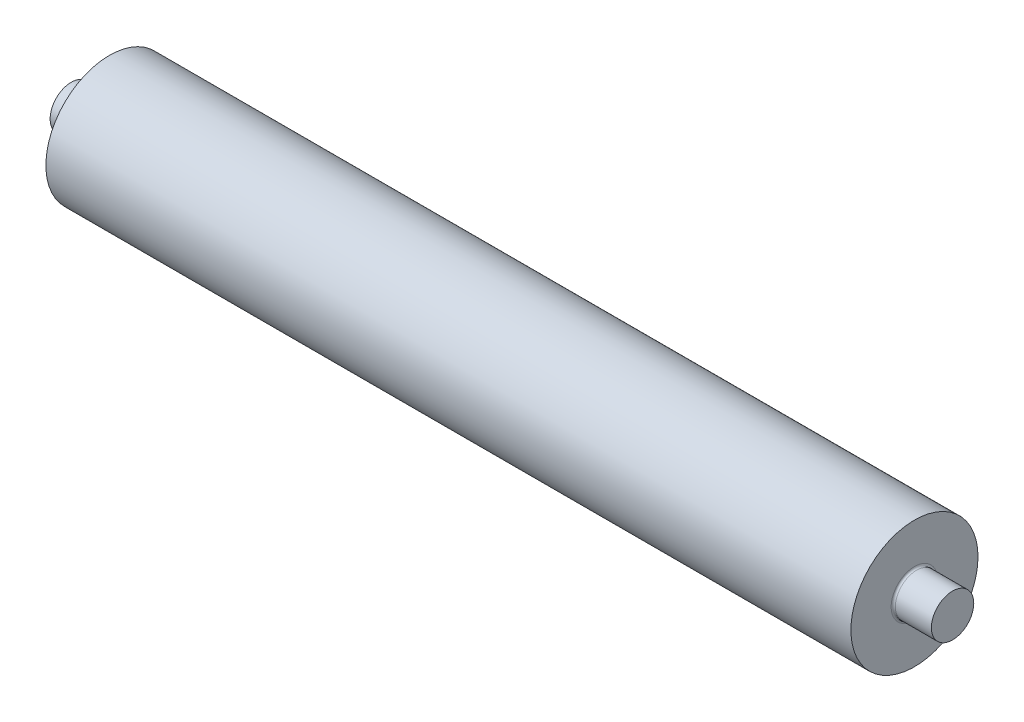
ISO-10303-21;
HEADER;
FILE_DESCRIPTION(('STEP AP214'),'2;1');
FILE_NAME('part.step','',(''),(''),'','','');
FILE_SCHEMA(('AUTOMOTIVE_DESIGN { 1 0 10303 214 1 1 1 1 }'));
ENDSEC;
DATA;
#1=APPLICATION_CONTEXT('core data for automotive mechanical design processes');
#2=APPLICATION_PROTOCOL_DEFINITION('international standard','automotive_design',2000,#1);
#3=PRODUCT_CONTEXT('',#1,'mechanical');
#4=PRODUCT('Part','Part','',(#3));
#5=PRODUCT_RELATED_PRODUCT_CATEGORY('part','',(#4));
#6=PRODUCT_DEFINITION_FORMATION('','',#4);
#7=PRODUCT_DEFINITION_CONTEXT('part definition',#1,'design');
#8=PRODUCT_DEFINITION('design','',#6,#7);
#9=PRODUCT_DEFINITION_SHAPE('','',#8);
#10=(LENGTH_UNIT() NAMED_UNIT(*) SI_UNIT(.MILLI.,.METRE.));
#11=(NAMED_UNIT(*) PLANE_ANGLE_UNIT() SI_UNIT($,.RADIAN.));
#12=(NAMED_UNIT(*) SI_UNIT($,.STERADIAN.) SOLID_ANGLE_UNIT());
#13=UNCERTAINTY_MEASURE_WITH_UNIT(LENGTH_MEASURE(1.E-05),#10,'distance_accuracy_value','');
#14=(GEOMETRIC_REPRESENTATION_CONTEXT(3) GLOBAL_UNCERTAINTY_ASSIGNED_CONTEXT((#13)) GLOBAL_UNIT_ASSIGNED_CONTEXT((#10,
#11,#12)) REPRESENTATION_CONTEXT('',''));
#15=CARTESIAN_POINT('',(0.,0.,0.));
#16=DIRECTION('',(0.,0.,1.));
#17=DIRECTION('',(1.,0.,0.));
#18=AXIS2_PLACEMENT_3D('',#15,#16,#17);
#19=CARTESIAN_POINT('',(1040.,0.,0.));
#20=DIRECTION('',(1.,0.,0.));
#21=DIRECTION('',(0.,0.,-1.));
#22=AXIS2_PLACEMENT_3D('',#19,#20,#21);
#23=PLANE('',#22);
#24=CARTESIAN_POINT('',(1040.,0.,0.));
#25=DIRECTION('',(1.,0.,0.));
#26=DIRECTION('',(0.,0.,-1.));
#27=AXIS2_PLACEMENT_3D('',#24,#25,#26);
#28=CIRCLE('',#27,49.9999999999999);
#29=CARTESIAN_POINT('',(1040.,0.,-49.9999999999999));
#30=VERTEX_POINT('',#29);
#31=EDGE_CURVE('E61',#30,#30,#28,.T.);
#32=ORIENTED_EDGE('',*,*,#31,.T.);
#33=EDGE_LOOP('',(#32));
#34=FACE_BOUND('',#33,.T.);
#35=ADVANCED_FACE('F41',(#34),#23,.T.);
#36=CARTESIAN_POINT('',(1040.,0.,0.));
#37=DIRECTION('',(1.,0.,0.));
#38=DIRECTION('',(0.,0.,-1.));
#39=AXIS2_PLACEMENT_3D('',#36,#37,#38);
#40=CYLINDRICAL_SURFACE('',#39,49.9999999999999);
#41=CARTESIAN_POINT('',(955.,0.,0.));
#42=DIRECTION('',(1.,0.,0.));
#43=DIRECTION('',(0.,0.,-1.));
#44=AXIS2_PLACEMENT_3D('',#41,#42,#43);
#45=CIRCLE('',#44,49.9999999999999);
#46=CARTESIAN_POINT('',(955.,0.,-49.9999999999999));
#47=VERTEX_POINT('',#46);
#48=EDGE_CURVE('E56',#47,#47,#45,.T.);
#49=ORIENTED_EDGE('',*,*,#48,.T.);
#50=EDGE_LOOP('',(#49));
#51=FACE_BOUND('',#50,.T.);
#52=ORIENTED_EDGE('',*,*,#31,.F.);
#53=EDGE_LOOP('',(#52));
#54=FACE_BOUND('',#53,.T.);
#55=ADVANCED_FACE('F90',(#51,#54),#40,.T.);
#56=CARTESIAN_POINT('',(950.,0.,-49.9999999999999));
#57=DIRECTION('',(1.,0.,0.));
#58=DIRECTION('',(0.,0.,-1.));
#59=AXIS2_PLACEMENT_3D('',#56,#57,#58);
#60=PLANE('',#59);
#61=CARTESIAN_POINT('',(950.,0.,0.));
#62=DIRECTION('',(1.,0.,0.));
#63=DIRECTION('',(0.,0.,-1.));
#64=AXIS2_PLACEMENT_3D('',#61,#62,#63);
#65=CIRCLE('',#64,54.9999999999999);
#66=CARTESIAN_POINT('',(950.,0.,-54.9999999999999));
#67=VERTEX_POINT('',#66);
#68=EDGE_CURVE('E52',#67,#67,#65,.F.);
#69=ORIENTED_EDGE('',*,*,#68,.T.);
#70=EDGE_LOOP('',(#69));
#71=FACE_BOUND('',#70,.T.);
#72=CARTESIAN_POINT('',(950.,0.,0.));
#73=DIRECTION('',(1.,0.,0.));
#74=DIRECTION('',(0.,0.,-1.));
#75=AXIS2_PLACEMENT_3D('',#72,#73,#74);
#76=CIRCLE('',#75,150.);
#77=CARTESIAN_POINT('',(950.,0.,-150.));
#78=VERTEX_POINT('',#77);
#79=EDGE_CURVE('E64',#78,#78,#76,.T.);
#80=ORIENTED_EDGE('',*,*,#79,.T.);
#81=EDGE_LOOP('',(#80));
#82=FACE_BOUND('',#81,.T.);
#83=ADVANCED_FACE('F95',(#71,#82),#60,.T.);
#84=CARTESIAN_POINT('',(1040.,0.,0.));
#85=DIRECTION('',(1.,0.,0.));
#86=DIRECTION('',(0.,0.,-1.));
#87=AXIS2_PLACEMENT_3D('',#84,#85,#86);
#88=CYLINDRICAL_SURFACE('',#87,150.);
#89=CARTESIAN_POINT('',(-950.,0.,0.));
#90=DIRECTION('',(1.,0.,0.));
#91=DIRECTION('',(0.,0.,-1.));
#92=AXIS2_PLACEMENT_3D('',#89,#90,#91);
#93=CIRCLE('',#92,150.);
#94=CARTESIAN_POINT('',(-950.,0.,-150.));
#95=VERTEX_POINT('',#94);
#96=EDGE_CURVE('E67',#95,#95,#93,.T.);
#97=ORIENTED_EDGE('',*,*,#96,.T.);
#98=EDGE_LOOP('',(#97));
#99=FACE_BOUND('',#98,.T.);
#100=ORIENTED_EDGE('',*,*,#79,.F.);
#101=EDGE_LOOP('',(#100));
#102=FACE_BOUND('',#101,.T.);
#103=ADVANCED_FACE('F101',(#99,#102),#88,.T.);
#104=CARTESIAN_POINT('',(-950.,0.,-49.9999999999999));
#105=DIRECTION('',(-1.,0.,0.));
#106=DIRECTION('',(0.,0.,1.));
#107=AXIS2_PLACEMENT_3D('',#104,#105,#106);
#108=PLANE('',#107);
#109=CARTESIAN_POINT('',(-950.,0.,0.));
#110=DIRECTION('',(-1.,0.,0.));
#111=DIRECTION('',(0.,0.,1.));
#112=AXIS2_PLACEMENT_3D('',#109,#110,#111);
#113=CIRCLE('',#112,54.9999999999999);
#114=CARTESIAN_POINT('',(-950.,0.,54.9999999999999));
#115=VERTEX_POINT('',#114);
#116=EDGE_CURVE('E48',#115,#115,#113,.F.);
#117=ORIENTED_EDGE('',*,*,#116,.T.);
#118=EDGE_LOOP('',(#117));
#119=FACE_BOUND('',#118,.T.);
#120=ORIENTED_EDGE('',*,*,#96,.F.);
#121=EDGE_LOOP('',(#120));
#122=FACE_BOUND('',#121,.T.);
#123=ADVANCED_FACE('F87',(#119,#122),#108,.T.);
#124=CARTESIAN_POINT('',(1040.,0.,0.));
#125=DIRECTION('',(1.,0.,0.));
#126=DIRECTION('',(0.,0.,-1.));
#127=AXIS2_PLACEMENT_3D('',#124,#125,#126);
#128=CYLINDRICAL_SURFACE('',#127,49.9999999999999);
#129=CARTESIAN_POINT('',(-955.,0.,0.));
#130=DIRECTION('',(-1.,0.,0.));
#131=DIRECTION('',(0.,0.,1.));
#132=AXIS2_PLACEMENT_3D('',#129,#130,#131);
#133=CIRCLE('',#132,49.9999999999999);
#134=CARTESIAN_POINT('',(-955.,0.,49.9999999999999));
#135=VERTEX_POINT('',#134);
#136=EDGE_CURVE('E10',#135,#135,#133,.T.);
#137=ORIENTED_EDGE('',*,*,#136,.T.);
#138=EDGE_LOOP('',(#137));
#139=FACE_BOUND('',#138,.T.);
#140=CARTESIAN_POINT('',(-1040.,0.,0.));
#141=DIRECTION('',(1.,0.,0.));
#142=DIRECTION('',(0.,0.,-1.));
#143=AXIS2_PLACEMENT_3D('',#140,#141,#142);
#144=CIRCLE('',#143,49.9999999999999);
#145=CARTESIAN_POINT('',(-1040.,0.,-49.9999999999999));
#146=VERTEX_POINT('',#145);
#147=EDGE_CURVE('E70',#146,#146,#144,.T.);
#148=ORIENTED_EDGE('',*,*,#147,.T.);
#149=EDGE_LOOP('',(#148));
#150=FACE_BOUND('',#149,.T.);
#151=ADVANCED_FACE('F74',(#139,#150),#128,.T.);
#152=CARTESIAN_POINT('',(-1040.,0.,0.));
#153=DIRECTION('',(-1.,0.,0.));
#154=DIRECTION('',(0.,0.,1.));
#155=AXIS2_PLACEMENT_3D('',#152,#153,#154);
#156=PLANE('',#155);
#157=ORIENTED_EDGE('',*,*,#147,.F.);
#158=EDGE_LOOP('',(#157));
#159=FACE_BOUND('',#158,.T.);
#160=ADVANCED_FACE('F76',(#159),#156,.T.);
#161=CARTESIAN_POINT('',(955.,0.,0.));
#162=DIRECTION('',(1.,0.,0.));
#163=DIRECTION('',(0.,0.,-1.));
#164=AXIS2_PLACEMENT_3D('',#161,#162,#163);
#165=TOROIDAL_SURFACE('',#164,54.9999999999999,5.);
#166=ORIENTED_EDGE('',*,*,#68,.F.);
#167=EDGE_LOOP('',(#166));
#168=FACE_BOUND('',#167,.T.);
#169=ORIENTED_EDGE('',*,*,#48,.F.);
#170=EDGE_LOOP('',(#169));
#171=FACE_BOUND('',#170,.T.);
#172=ADVANCED_FACE('F78',(#168,#171),#165,.F.);
#173=CARTESIAN_POINT('',(-955.,0.,0.));
#174=DIRECTION('',(-1.,0.,0.));
#175=DIRECTION('',(0.,0.,1.));
#176=AXIS2_PLACEMENT_3D('',#173,#174,#175);
#177=TOROIDAL_SURFACE('',#176,54.9999999999999,5.);
#178=ORIENTED_EDGE('',*,*,#136,.F.);
#179=EDGE_LOOP('',(#178));
#180=FACE_BOUND('',#179,.T.);
#181=ORIENTED_EDGE('',*,*,#116,.F.);
#182=EDGE_LOOP('',(#181));
#183=FACE_BOUND('',#182,.T.);
#184=ADVANCED_FACE('F43',(#180,#183),#177,.F.);
#185=CLOSED_SHELL('',(#35,#55,#83,#103,#123,#151,#160,#172,#184));
#186=MANIFOLD_SOLID_BREP('B2',#185);
#187=ADVANCED_BREP_SHAPE_REPRESENTATION('',(#18,#186),#14);
#188=SHAPE_DEFINITION_REPRESENTATION(#9,#187);
ENDSEC;
END-ISO-10303-21;
